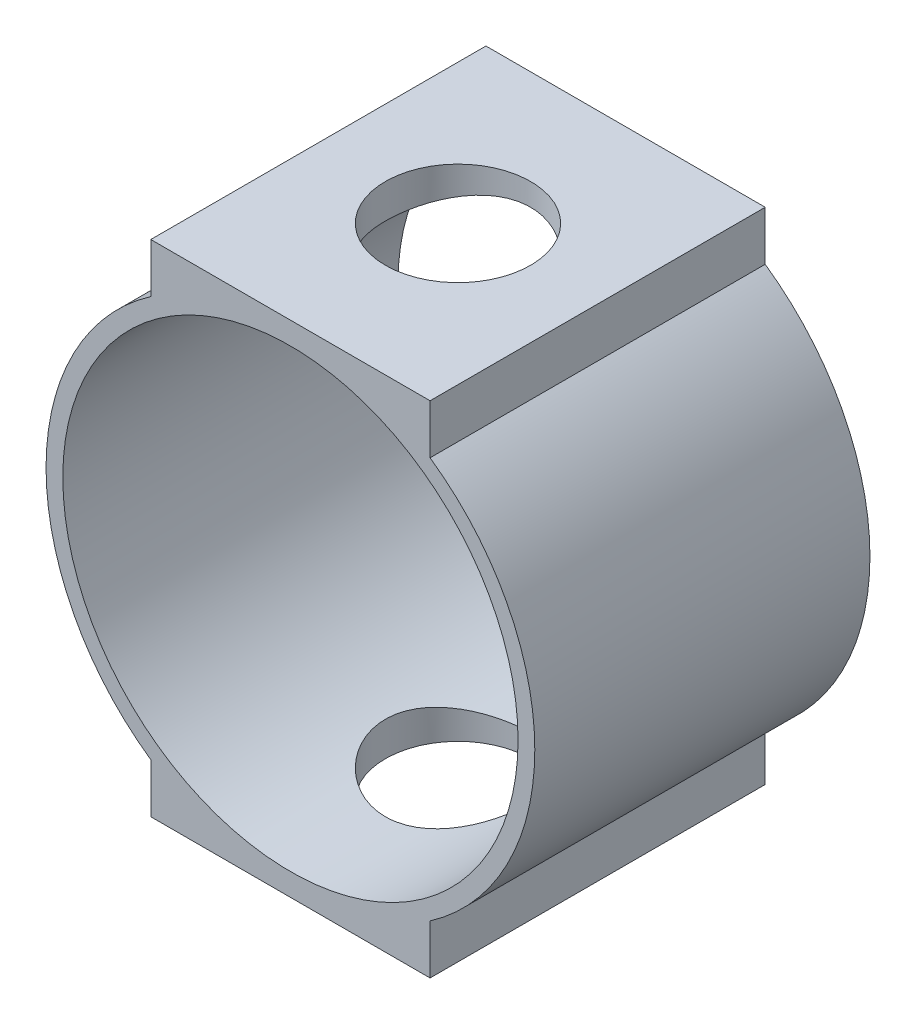
ISO-10303-21;
HEADER;
FILE_DESCRIPTION(('STEP AP214'),'2;1');
FILE_NAME('part.step','',(''),(''),'','','');
FILE_SCHEMA(('AUTOMOTIVE_DESIGN { 1 0 10303 214 1 1 1 1 }'));
ENDSEC;
DATA;
#1=APPLICATION_CONTEXT('core data for automotive mechanical design processes');
#2=APPLICATION_PROTOCOL_DEFINITION('international standard','automotive_design',2000,#1);
#3=PRODUCT_CONTEXT('',#1,'mechanical');
#4=PRODUCT('Part','Part','',(#3));
#5=PRODUCT_RELATED_PRODUCT_CATEGORY('part','',(#4));
#6=PRODUCT_DEFINITION_FORMATION('','',#4);
#7=PRODUCT_DEFINITION_CONTEXT('part definition',#1,'design');
#8=PRODUCT_DEFINITION('design','',#6,#7);
#9=PRODUCT_DEFINITION_SHAPE('','',#8);
#10=(LENGTH_UNIT() NAMED_UNIT(*) SI_UNIT(.MILLI.,.METRE.));
#11=(NAMED_UNIT(*) PLANE_ANGLE_UNIT() SI_UNIT($,.RADIAN.));
#12=(NAMED_UNIT(*) SI_UNIT($,.STERADIAN.) SOLID_ANGLE_UNIT());
#13=UNCERTAINTY_MEASURE_WITH_UNIT(LENGTH_MEASURE(1.E-05),#10,'distance_accuracy_value','');
#14=(GEOMETRIC_REPRESENTATION_CONTEXT(3) GLOBAL_UNCERTAINTY_ASSIGNED_CONTEXT((#13)) GLOBAL_UNIT_ASSIGNED_CONTEXT((#10,
#11,#12)) REPRESENTATION_CONTEXT('',''));
#15=CARTESIAN_POINT('',(0.,0.,0.));
#16=DIRECTION('',(0.,0.,1.));
#17=DIRECTION('',(1.,0.,0.));
#18=AXIS2_PLACEMENT_3D('',#15,#16,#17);
#19=CARTESIAN_POINT('',(-5.,-8.95,-6.));
#20=DIRECTION('',(0.,-1.,0.));
#21=DIRECTION('',(1.,0.,0.));
#22=AXIS2_PLACEMENT_3D('',#19,#20,#21);
#23=PLANE('',#22);
#24=CARTESIAN_POINT('',(0.,-8.95,0.));
#25=DIRECTION('',(0.,1.,0.));
#26=DIRECTION('',(0.,0.,1.));
#27=AXIS2_PLACEMENT_3D('',#24,#25,#26);
#28=CIRCLE('',#27,2.6);
#29=CARTESIAN_POINT('',(0.,-8.95,2.6));
#30=VERTEX_POINT('',#29);
#31=EDGE_CURVE('E182',#30,#30,#28,.T.);
#32=ORIENTED_EDGE('',*,*,#31,.T.);
#33=EDGE_LOOP('',(#32));
#34=FACE_BOUND('',#33,.T.);
#35=DIRECTION('',(0.,0.,1.));
#36=VECTOR('',#35,1.);
#37=CARTESIAN_POINT('',(5.,-8.95,-6.));
#38=LINE('',#37,#36);
#39=CARTESIAN_POINT('',(5.,-8.95,-6.));
#40=VERTEX_POINT('',#39);
#41=CARTESIAN_POINT('',(5.,-8.95,6.));
#42=VERTEX_POINT('',#41);
#43=EDGE_CURVE('E104',#40,#42,#38,.T.);
#44=ORIENTED_EDGE('',*,*,#43,.T.);
#45=DIRECTION('',(1.,0.,0.));
#46=VECTOR('',#45,1.);
#47=CARTESIAN_POINT('',(-5.,-8.95,6.));
#48=LINE('',#47,#46);
#49=CARTESIAN_POINT('',(-5.,-8.95,6.));
#50=VERTEX_POINT('',#49);
#51=EDGE_CURVE('E107',#50,#42,#48,.T.);
#52=ORIENTED_EDGE('',*,*,#51,.F.);
#53=DIRECTION('',(0.,0.,1.));
#54=VECTOR('',#53,1.);
#55=CARTESIAN_POINT('',(-5.,-8.95,-6.));
#56=LINE('',#55,#54);
#57=CARTESIAN_POINT('',(-5.,-8.95,-6.));
#58=VERTEX_POINT('',#57);
#59=EDGE_CURVE('E11',#58,#50,#56,.T.);
#60=ORIENTED_EDGE('',*,*,#59,.F.);
#61=DIRECTION('',(1.,0.,0.));
#62=VECTOR('',#61,1.);
#63=CARTESIAN_POINT('',(-5.,-8.95,-6.));
#64=LINE('',#63,#62);
#65=EDGE_CURVE('E108',#58,#40,#64,.T.);
#66=ORIENTED_EDGE('',*,*,#65,.T.);
#67=EDGE_LOOP('',(#44,#52,#60,#66));
#68=FACE_BOUND('',#67,.T.);
#69=ADVANCED_FACE('F37',(#34,#68),#23,.T.);
#70=CARTESIAN_POINT('',(-5.,-8.95,-6.));
#71=DIRECTION('',(-1.,0.,0.));
#72=DIRECTION('',(0.,-1.,0.));
#73=AXIS2_PLACEMENT_3D('',#70,#71,#72);
#74=PLANE('',#73);
#75=ORIENTED_EDGE('',*,*,#59,.T.);
#76=DIRECTION('',(0.,-1.,0.));
#77=VECTOR('',#76,1.);
#78=CARTESIAN_POINT('',(-5.,-8.95,6.));
#79=LINE('',#78,#77);
#80=CARTESIAN_POINT('',(-5.,-7.18070330817253,6.));
#81=VERTEX_POINT('',#80);
#82=EDGE_CURVE('E127',#81,#50,#79,.T.);
#83=ORIENTED_EDGE('',*,*,#82,.F.);
#84=DIRECTION('',(0.,0.,1.));
#85=VECTOR('',#84,1.);
#86=CARTESIAN_POINT('',(-5.,-7.18070330817253,-6.));
#87=LINE('',#86,#85);
#88=CARTESIAN_POINT('',(-5.,-7.18070330817253,-6.));
#89=VERTEX_POINT('',#88);
#90=EDGE_CURVE('E50',#89,#81,#87,.T.);
#91=ORIENTED_EDGE('',*,*,#90,.F.);
#92=DIRECTION('',(0.,-1.,0.));
#93=VECTOR('',#92,1.);
#94=CARTESIAN_POINT('',(-5.,-8.95,-6.));
#95=LINE('',#94,#93);
#96=EDGE_CURVE('E113',#89,#58,#95,.T.);
#97=ORIENTED_EDGE('',*,*,#96,.T.);
#98=EDGE_LOOP('',(#75,#83,#91,#97));
#99=FACE_BOUND('',#98,.T.);
#100=ADVANCED_FACE('F202',(#99),#74,.T.);
#101=CARTESIAN_POINT('',(0.,0.,-6.));
#102=DIRECTION('',(0.,0.,1.));
#103=DIRECTION('',(1.,0.,0.));
#104=AXIS2_PLACEMENT_3D('',#101,#102,#103);
#105=CYLINDRICAL_SURFACE('',#104,8.75);
#106=ORIENTED_EDGE('',*,*,#90,.T.);
#107=CARTESIAN_POINT('',(0.,0.,6.));
#108=DIRECTION('',(0.,0.,1.));
#109=DIRECTION('',(1.,0.,0.));
#110=AXIS2_PLACEMENT_3D('',#107,#108,#109);
#111=CIRCLE('',#110,8.75);
#112=CARTESIAN_POINT('',(-5.,7.18070330817254,6.));
#113=VERTEX_POINT('',#112);
#114=EDGE_CURVE('E144',#113,#81,#111,.T.);
#115=ORIENTED_EDGE('',*,*,#114,.F.);
#116=DIRECTION('',(0.,0.,1.));
#117=VECTOR('',#116,1.);
#118=CARTESIAN_POINT('',(-5.,7.18070330817254,-6.));
#119=LINE('',#118,#117);
#120=CARTESIAN_POINT('',(-5.,7.18070330817254,-6.));
#121=VERTEX_POINT('',#120);
#122=EDGE_CURVE('E169',#121,#113,#119,.T.);
#123=ORIENTED_EDGE('',*,*,#122,.F.);
#124=CARTESIAN_POINT('',(0.,0.,-6.));
#125=DIRECTION('',(0.,0.,1.));
#126=DIRECTION('',(1.,0.,0.));
#127=AXIS2_PLACEMENT_3D('',#124,#125,#126);
#128=CIRCLE('',#127,8.75);
#129=EDGE_CURVE('E165',#121,#89,#128,.T.);
#130=ORIENTED_EDGE('',*,*,#129,.T.);
#131=EDGE_LOOP('',(#106,#115,#123,#130));
#132=FACE_BOUND('',#131,.T.);
#133=ADVANCED_FACE('F207',(#132),#105,.T.);
#134=CARTESIAN_POINT('',(-5.,8.95,-6.));
#135=DIRECTION('',(-1.,0.,0.));
#136=DIRECTION('',(0.,-1.,0.));
#137=AXIS2_PLACEMENT_3D('',#134,#135,#136);
#138=PLANE('',#137);
#139=ORIENTED_EDGE('',*,*,#122,.T.);
#140=DIRECTION('',(0.,-1.,0.));
#141=VECTOR('',#140,1.);
#142=CARTESIAN_POINT('',(-5.,8.95,6.));
#143=LINE('',#142,#141);
#144=CARTESIAN_POINT('',(-5.,8.95,6.));
#145=VERTEX_POINT('',#144);
#146=EDGE_CURVE('E141',#145,#113,#143,.T.);
#147=ORIENTED_EDGE('',*,*,#146,.F.);
#148=DIRECTION('',(0.,0.,1.));
#149=VECTOR('',#148,1.);
#150=CARTESIAN_POINT('',(-5.,8.95,-6.));
#151=LINE('',#150,#149);
#152=CARTESIAN_POINT('',(-5.,8.95,-6.));
#153=VERTEX_POINT('',#152);
#154=EDGE_CURVE('E171',#153,#145,#151,.T.);
#155=ORIENTED_EDGE('',*,*,#154,.F.);
#156=DIRECTION('',(0.,-1.,0.));
#157=VECTOR('',#156,1.);
#158=CARTESIAN_POINT('',(-5.,8.95,-6.));
#159=LINE('',#158,#157);
#160=EDGE_CURVE('E162',#153,#121,#159,.T.);
#161=ORIENTED_EDGE('',*,*,#160,.T.);
#162=EDGE_LOOP('',(#139,#147,#155,#161));
#163=FACE_BOUND('',#162,.T.);
#164=ADVANCED_FACE('F221',(#163),#138,.T.);
#165=CARTESIAN_POINT('',(-5.,8.95,-6.));
#166=DIRECTION('',(0.,1.,0.));
#167=DIRECTION('',(-1.,0.,0.));
#168=AXIS2_PLACEMENT_3D('',#165,#166,#167);
#169=PLANE('',#168);
#170=CARTESIAN_POINT('',(0.,8.95,0.));
#171=DIRECTION('',(0.,1.,0.));
#172=DIRECTION('',(0.,0.,1.));
#173=AXIS2_PLACEMENT_3D('',#170,#171,#172);
#174=CIRCLE('',#173,2.6);
#175=CARTESIAN_POINT('',(0.,8.95,2.6));
#176=VERTEX_POINT('',#175);
#177=EDGE_CURVE('E211',#176,#176,#174,.T.);
#178=ORIENTED_EDGE('',*,*,#177,.F.);
#179=EDGE_LOOP('',(#178));
#180=FACE_BOUND('',#179,.T.);
#181=ORIENTED_EDGE('',*,*,#154,.T.);
#182=DIRECTION('',(-1.,0.,0.));
#183=VECTOR('',#182,1.);
#184=CARTESIAN_POINT('',(-5.,8.95,6.));
#185=LINE('',#184,#183);
#186=CARTESIAN_POINT('',(5.,8.95,6.));
#187=VERTEX_POINT('',#186);
#188=EDGE_CURVE('E138',#187,#145,#185,.T.);
#189=ORIENTED_EDGE('',*,*,#188,.F.);
#190=DIRECTION('',(0.,0.,1.));
#191=VECTOR('',#190,1.);
#192=CARTESIAN_POINT('',(5.,8.95,-6.));
#193=LINE('',#192,#191);
#194=CARTESIAN_POINT('',(5.,8.95,-6.));
#195=VERTEX_POINT('',#194);
#196=EDGE_CURVE('E173',#195,#187,#193,.T.);
#197=ORIENTED_EDGE('',*,*,#196,.F.);
#198=DIRECTION('',(-1.,0.,0.));
#199=VECTOR('',#198,1.);
#200=CARTESIAN_POINT('',(-5.,8.95,-6.));
#201=LINE('',#200,#199);
#202=EDGE_CURVE('E159',#195,#153,#201,.T.);
#203=ORIENTED_EDGE('',*,*,#202,.T.);
#204=EDGE_LOOP('',(#181,#189,#197,#203));
#205=FACE_BOUND('',#204,.T.);
#206=ADVANCED_FACE('F217',(#180,#205),#169,.T.);
#207=CARTESIAN_POINT('',(5.,8.95,-6.));
#208=DIRECTION('',(1.,0.,0.));
#209=DIRECTION('',(0.,1.,0.));
#210=AXIS2_PLACEMENT_3D('',#207,#208,#209);
#211=PLANE('',#210);
#212=ORIENTED_EDGE('',*,*,#196,.T.);
#213=DIRECTION('',(0.,1.,0.));
#214=VECTOR('',#213,1.);
#215=CARTESIAN_POINT('',(5.,8.95,6.));
#216=LINE('',#215,#214);
#217=CARTESIAN_POINT('',(5.,7.18070330817254,6.));
#218=VERTEX_POINT('',#217);
#219=EDGE_CURVE('E135',#218,#187,#216,.T.);
#220=ORIENTED_EDGE('',*,*,#219,.F.);
#221=DIRECTION('',(0.,0.,1.));
#222=VECTOR('',#221,1.);
#223=CARTESIAN_POINT('',(5.,7.18070330817254,-6.));
#224=LINE('',#223,#222);
#225=CARTESIAN_POINT('',(5.,7.18070330817254,-6.));
#226=VERTEX_POINT('',#225);
#227=EDGE_CURVE('E175',#226,#218,#224,.T.);
#228=ORIENTED_EDGE('',*,*,#227,.F.);
#229=DIRECTION('',(0.,1.,0.));
#230=VECTOR('',#229,1.);
#231=CARTESIAN_POINT('',(5.,8.95,-6.));
#232=LINE('',#231,#230);
#233=EDGE_CURVE('E156',#226,#195,#232,.T.);
#234=ORIENTED_EDGE('',*,*,#233,.T.);
#235=EDGE_LOOP('',(#212,#220,#228,#234));
#236=FACE_BOUND('',#235,.T.);
#237=ADVANCED_FACE('F220',(#236),#211,.T.);
#238=CARTESIAN_POINT('',(0.,0.,-6.));
#239=DIRECTION('',(0.,0.,1.));
#240=DIRECTION('',(1.,0.,0.));
#241=AXIS2_PLACEMENT_3D('',#238,#239,#240);
#242=CYLINDRICAL_SURFACE('',#241,8.75);
#243=ORIENTED_EDGE('',*,*,#227,.T.);
#244=CARTESIAN_POINT('',(0.,0.,6.));
#245=DIRECTION('',(0.,0.,1.));
#246=DIRECTION('',(1.,0.,0.));
#247=AXIS2_PLACEMENT_3D('',#244,#245,#246);
#248=CIRCLE('',#247,8.75);
#249=CARTESIAN_POINT('',(5.,-7.18070330817253,6.));
#250=VERTEX_POINT('',#249);
#251=EDGE_CURVE('E121',#250,#218,#248,.T.);
#252=ORIENTED_EDGE('',*,*,#251,.F.);
#253=DIRECTION('',(0.,0.,1.));
#254=VECTOR('',#253,1.);
#255=CARTESIAN_POINT('',(5.,-7.18070330817253,-6.));
#256=LINE('',#255,#254);
#257=CARTESIAN_POINT('',(5.,-7.18070330817253,-6.));
#258=VERTEX_POINT('',#257);
#259=EDGE_CURVE('E112',#258,#250,#256,.T.);
#260=ORIENTED_EDGE('',*,*,#259,.F.);
#261=CARTESIAN_POINT('',(0.,0.,-6.));
#262=DIRECTION('',(0.,0.,1.));
#263=DIRECTION('',(1.,0.,0.));
#264=AXIS2_PLACEMENT_3D('',#261,#262,#263);
#265=CIRCLE('',#264,8.75);
#266=EDGE_CURVE('E153',#258,#226,#265,.T.);
#267=ORIENTED_EDGE('',*,*,#266,.T.);
#268=EDGE_LOOP('',(#243,#252,#260,#267));
#269=FACE_BOUND('',#268,.T.);
#270=ADVANCED_FACE('F237',(#269),#242,.T.);
#271=CARTESIAN_POINT('',(5.,-8.95,-6.));
#272=DIRECTION('',(1.,0.,0.));
#273=DIRECTION('',(0.,0.,-1.));
#274=AXIS2_PLACEMENT_3D('',#271,#272,#273);
#275=PLANE('',#274);
#276=ORIENTED_EDGE('',*,*,#259,.T.);
#277=DIRECTION('',(0.,1.,0.));
#278=VECTOR('',#277,1.);
#279=CARTESIAN_POINT('',(5.,-8.95,6.));
#280=LINE('',#279,#278);
#281=EDGE_CURVE('E116',#42,#250,#280,.T.);
#282=ORIENTED_EDGE('',*,*,#281,.F.);
#283=ORIENTED_EDGE('',*,*,#43,.F.);
#284=DIRECTION('',(0.,1.,0.));
#285=VECTOR('',#284,1.);
#286=CARTESIAN_POINT('',(5.,-8.95,-6.));
#287=LINE('',#286,#285);
#288=EDGE_CURVE('E151',#40,#258,#287,.T.);
#289=ORIENTED_EDGE('',*,*,#288,.T.);
#290=EDGE_LOOP('',(#276,#282,#283,#289));
#291=FACE_BOUND('',#290,.T.);
#292=ADVANCED_FACE('F117',(#291),#275,.T.);
#293=CARTESIAN_POINT('',(0.,0.,-6.));
#294=DIRECTION('',(0.,0.,1.));
#295=DIRECTION('',(1.,0.,0.));
#296=AXIS2_PLACEMENT_3D('',#293,#294,#295);
#297=PLANE('',#296);
#298=CARTESIAN_POINT('',(0.,0.,-6.));
#299=DIRECTION('',(0.,0.,1.));
#300=DIRECTION('',(1.,0.,0.));
#301=AXIS2_PLACEMENT_3D('',#298,#299,#300);
#302=CIRCLE('',#301,8.15);
#303=CARTESIAN_POINT('',(8.15,0.,-6.));
#304=VERTEX_POINT('',#303);
#305=EDGE_CURVE('E147',#304,#304,#302,.T.);
#306=ORIENTED_EDGE('',*,*,#305,.T.);
#307=EDGE_LOOP('',(#306));
#308=FACE_BOUND('',#307,.T.);
#309=ORIENTED_EDGE('',*,*,#65,.F.);
#310=ORIENTED_EDGE('',*,*,#96,.F.);
#311=ORIENTED_EDGE('',*,*,#129,.F.);
#312=ORIENTED_EDGE('',*,*,#160,.F.);
#313=ORIENTED_EDGE('',*,*,#202,.F.);
#314=ORIENTED_EDGE('',*,*,#233,.F.);
#315=ORIENTED_EDGE('',*,*,#266,.F.);
#316=ORIENTED_EDGE('',*,*,#288,.F.);
#317=EDGE_LOOP('',(#309,#310,#311,#312,#313,#314,#315,#316));
#318=FACE_BOUND('',#317,.T.);
#319=ADVANCED_FACE('F199',(#308,#318),#297,.F.);
#320=CARTESIAN_POINT('',(0.,0.,-6.));
#321=DIRECTION('',(0.,0.,1.));
#322=DIRECTION('',(1.,0.,0.));
#323=AXIS2_PLACEMENT_3D('',#320,#321,#322);
#324=CYLINDRICAL_SURFACE('',#323,8.15);
#325=CARTESIAN_POINT('',(0.,-8.15,2.6));
#326=CARTESIAN_POINT('',(-0.142203505543342,-8.14999960176957,2.59999953192596));
#327=CARTESIAN_POINT('',(-0.284412564499907,-8.14624330447423,2.58829525410423));
#328=CARTESIAN_POINT('',(-0.564662629022311,-8.13162729718018,2.5419163710565));
#329=CARTESIAN_POINT('',(-0.70270284456147,-8.12076624950664,2.50723744017159));
#330=CARTESIAN_POINT('',(-0.970533832975618,-8.09312529483324,2.41620434909736));
#331=CARTESIAN_POINT('',(-1.10033731259692,-8.07635477987373,2.35988457038684));
#332=CARTESIAN_POINT('',(-1.34865766367496,-8.03862035554553,2.22731758449882));
#333=CARTESIAN_POINT('',(-1.4671726095874,-8.01765573264998,2.15106698589283));
#334=CARTESIAN_POINT('',(-1.69334964355843,-7.9730012459855,1.97823265063891));
#335=CARTESIAN_POINT('',(-1.80059948222446,-7.94925016538218,1.88112531626175));
#336=CARTESIAN_POINT('',(-1.99760068354416,-7.90204869336876,1.67044834944998));
#337=CARTESIAN_POINT('',(-2.08734861230465,-7.87859836180743,1.55687549406823));
#338=CARTESIAN_POINT('',(-2.24906958275262,-7.83399158743093,1.31287899701797));
#339=CARTESIAN_POINT('',(-2.32052124237097,-7.81291041359703,1.18209471046042));
#340=CARTESIAN_POINT('',(-2.44024305375827,-7.77635266503883,0.909584836043497));
#341=CARTESIAN_POINT('',(-2.48851960566809,-7.76087454324145,0.767862281509332));
#342=CARTESIAN_POINT('',(-2.55900063183534,-7.73791702111249,0.482162265851609));
#343=CARTESIAN_POINT('',(-2.58197226466877,-7.73020291295947,0.338393455238453));
#344=CARTESIAN_POINT('',(-2.60358860386407,-7.72295076103129,0.0488512809469417));
#345=CARTESIAN_POINT('',(-2.60224009279163,-7.72341043769543,-0.0969215125151101));
#346=CARTESIAN_POINT('',(-2.57585309536015,-7.73224719865844,-0.379928530138107));
#347=CARTESIAN_POINT('',(-2.5517976262642,-7.74029573413663,-0.517266411085056));
#348=CARTESIAN_POINT('',(-2.48227638831988,-7.76286842224203,-0.785844795620059));
#349=CARTESIAN_POINT('',(-2.43680825638451,-7.77739328958344,-0.91708462447448));
#350=CARTESIAN_POINT('',(-2.32507389191065,-7.81152837254946,-1.17204986341004));
#351=CARTESIAN_POINT('',(-2.25850436671023,-7.83121197147246,-1.29563211302177));
#352=CARTESIAN_POINT('',(-2.10666746684603,-7.8734139348707,-1.53019075287226));
#353=CARTESIAN_POINT('',(-2.02139506480944,-7.89593306084709,-1.64116374151619));
#354=CARTESIAN_POINT('',(-1.8297806831284,-7.9425790032405,-1.85290106159538));
#355=CARTESIAN_POINT('',(-1.72262955339293,-7.96673134571414,-1.95292891251348));
#356=CARTESIAN_POINT('',(-1.49277387168404,-8.01298019147837,-2.13377890847255));
#357=CARTESIAN_POINT('',(-1.37006806952173,-8.03507652927215,-2.21459950825013));
#358=CARTESIAN_POINT('',(-1.11112328692127,-8.07497282684995,-2.35526819501214));
#359=CARTESIAN_POINT('',(-0.974779075949874,-8.09273505248992,-2.41493400138804));
#360=CARTESIAN_POINT('',(-0.693289270583578,-8.12168902049882,-2.51026122336192));
#361=CARTESIAN_POINT('',(-0.548146482045122,-8.13288284548824,-2.54593024806411));
#362=CARTESIAN_POINT('',(-0.259425927101593,-8.14710060959532,-2.59098148942592));
#363=CARTESIAN_POINT('',(-0.11601866198274,-8.15043406578483,-2.60136014307767));
#364=CARTESIAN_POINT('',(0.170507439062349,-8.14947485960939,-2.59835436593639));
#365=CARTESIAN_POINT('',(0.313626315751039,-8.1451833636448,-2.58497356966224));
#366=CARTESIAN_POINT('',(0.591625296624572,-8.12966016383614,-2.53562531272935));
#367=CARTESIAN_POINT('',(0.726622939135559,-8.11861252631497,-2.50025649047762));
#368=CARTESIAN_POINT('',(0.988725350698189,-8.09087791141474,-2.40867213463251));
#369=CARTESIAN_POINT('',(1.11582913113026,-8.07419022936117,-2.35245399601297));
#370=CARTESIAN_POINT('',(1.36207294235109,-8.03636567180337,-2.21919925029278));
#371=CARTESIAN_POINT('',(1.48093438604583,-8.01512798276128,-2.14167725055028));
#372=CARTESIAN_POINT('',(1.70429264545503,-7.97062594914018,-1.9685938796744));
#373=CARTESIAN_POINT('',(1.80878539657931,-7.94736103413116,-1.87302742222534));
#374=CARTESIAN_POINT('',(2.00493471687227,-7.900211549245,-1.6618802984464));
#375=CARTESIAN_POINT('',(2.09588067809248,-7.87634120648332,-1.54563478823418));
#376=CARTESIAN_POINT('',(2.25704582565401,-7.83168320318836,-1.2990147249848));
#377=CARTESIAN_POINT('',(2.32726520484013,-7.81089551397427,-1.16864030342166));
#378=CARTESIAN_POINT('',(2.44457689898703,-7.77498023357565,-0.897642167126483));
#379=CARTESIAN_POINT('',(2.49174714788359,-7.75983361067107,-0.757054863002286));
#380=CARTESIAN_POINT('',(2.56156261296978,-7.73707125576271,-0.469346570496737));
#381=CARTESIAN_POINT('',(2.5842176750627,-7.72945250048865,-0.322228229872998));
#382=CARTESIAN_POINT('',(2.60363336408836,-7.72293250945406,-0.0330881435754913));
#383=CARTESIAN_POINT('',(2.60156383774209,-7.72363741943296,0.108847106944111));
#384=CARTESIAN_POINT('',(2.57443005545274,-7.73272331710791,0.390239276185882));
#385=CARTESIAN_POINT('',(2.5493669586196,-7.741103917871,0.529696319473684));
#386=CARTESIAN_POINT('',(2.4777548485648,-7.7643160185789,0.799984478447507));
#387=CARTESIAN_POINT('',(2.43155405508461,-7.77904275291031,0.930917538655435));
#388=CARTESIAN_POINT('',(2.31925439492733,-7.81325724028084,1.18327712490155));
#389=CARTESIAN_POINT('',(2.25315136103076,-7.83274599025077,1.30470165328511));
#390=CARTESIAN_POINT('',(2.09979213809291,-7.87527398149951,1.53992731782664));
#391=CARTESIAN_POINT('',(2.01178713947454,-7.89842511767899,1.653219951573));
#392=CARTESIAN_POINT('',(1.81842376486647,-7.94516931099663,1.86380783228797));
#393=CARTESIAN_POINT('',(1.71306066845869,-7.96876248679343,1.96109871326565));
#394=CARTESIAN_POINT('',(1.48359515038869,-8.01471041004328,2.14029318602048));
#395=CARTESIAN_POINT('',(1.35897111150286,-8.03699422015018,2.22154911530181));
#396=CARTESIAN_POINT('',(1.09712394161239,-8.07690031608166,2.36185541650831));
#397=CARTESIAN_POINT('',(0.959905265979692,-8.09452424185102,2.42091360353801));
#398=CARTESIAN_POINT('',(0.687011664483948,-8.12206510068652,2.51140637956852));
#399=CARTESIAN_POINT('',(0.551943046794303,-8.13244730416438,2.54453010711903));
#400=CARTESIAN_POINT('',(0.277917470276983,-8.14641418951909,2.58882469520039));
#401=CARTESIAN_POINT('',(0.138961386675345,-8.15000038915112,2.60000045740235));
#402=CARTESIAN_POINT('',(0.,-8.15,2.6));
#403=B_SPLINE_CURVE_WITH_KNOTS('',3,(#325,#326,#327,#328,#329,#330,#331,#332,#333,#334,#335,
#336,#337,#338,#339,#340,#341,#342,#343,#344,#345,#346,#347,#348,#349,#350,#351,#352,#353,#354,
#355,#356,#357,#358,#359,#360,#361,#362,#363,#364,#365,#366,#367,#368,#369,#370,#371,#372,#373,
#374,#375,#376,#377,#378,#379,#380,#381,#382,#383,#384,#385,#386,#387,#388,#389,#390,#391,#392,
#393,#394,#395,#396,#397,#398,#399,#400,#401,#402),.UNSPECIFIED.,.T.,.F.,(4,2,2,2,2,2,2,2,2,2,2,
2,2,2,2,2,2,2,2,2,2,2,2,2,2,2,2,2,2,2,2,2,2,2,2,2,2,2,4),(0.,0.426099557552509,
0.852279363775813,1.27778486601593,1.70336281946395,2.14123076555025,2.57918453554548,
3.02849710012959,3.47768550907077,3.91284552369596,4.34788417983968,4.76491331414525,
5.18198848229292,5.60535308062191,6.02883162002454,6.47244959606541,6.91610325002461,
7.36349171608204,7.81073825344177,8.24005608216324,8.66930824314677,9.08735671378468,
9.50545743526279,9.93401223659283,10.3626880184458,10.8091128452844,11.2555335183547,
11.7004341210044,12.1451559742115,12.5689224991852,12.9926676631875,13.4096703829569,
13.8267604774016,14.2607567752947,14.694871290976,15.1439824071549,15.5929352574494,
16.0094131310228,16.4257979814033),.UNSPECIFIED.);
#404=CARTESIAN_POINT('',(0.,-8.15,2.6));
#405=VERTEX_POINT('',#404);
#406=EDGE_CURVE('E40',#405,#405,#403,.T.);
#407=ORIENTED_EDGE('',*,*,#406,.T.);
#408=EDGE_LOOP('',(#407));
#409=FACE_BOUND('',#408,.T.);
#410=CARTESIAN_POINT('',(0.,8.15,2.6));
#411=CARTESIAN_POINT('',(0.142203505543339,8.14999960176957,2.59999953192596));
#412=CARTESIAN_POINT('',(0.284412564499904,8.14624330447423,2.58829525410423));
#413=CARTESIAN_POINT('',(0.564662629022308,8.13162729718018,2.5419163710565));
#414=CARTESIAN_POINT('',(0.702702844561467,8.12076624950664,2.50723744017159));
#415=CARTESIAN_POINT('',(0.970533832975615,8.09312529483324,2.41620434909736));
#416=CARTESIAN_POINT('',(1.10033731259692,8.07635477987373,2.35988457038684));
#417=CARTESIAN_POINT('',(1.34865766367496,8.03862035554553,2.22731758449882));
#418=CARTESIAN_POINT('',(1.4671726095874,8.01765573264998,2.15106698589283));
#419=CARTESIAN_POINT('',(1.69334964355843,7.9730012459855,1.9782326506389));
#420=CARTESIAN_POINT('',(1.80059948222446,7.94925016538218,1.88112531626175));
#421=CARTESIAN_POINT('',(1.99760068354416,7.90204869336876,1.67044834944998));
#422=CARTESIAN_POINT('',(2.08734861230465,7.87859836180743,1.55687549406823));
#423=CARTESIAN_POINT('',(2.24906958275262,7.83399158743093,1.31287899701797));
#424=CARTESIAN_POINT('',(2.32052124237097,7.81291041359703,1.18209471046042));
#425=CARTESIAN_POINT('',(2.44024305375826,7.77635266503883,0.909584836043496));
#426=CARTESIAN_POINT('',(2.48851960566808,7.76087454324145,0.767862281509331));
#427=CARTESIAN_POINT('',(2.55900063183534,7.73791702111249,0.482162265851608));
#428=CARTESIAN_POINT('',(2.58197226466877,7.73020291295947,0.338393455238452));
#429=CARTESIAN_POINT('',(2.60358860386407,7.72295076103129,0.048851280946941));
#430=CARTESIAN_POINT('',(2.60224009279163,7.72341043769543,-0.0969215125151108));
#431=CARTESIAN_POINT('',(2.57585309536015,7.73224719865844,-0.379928530138107));
#432=CARTESIAN_POINT('',(2.5517976262642,7.74029573413663,-0.517266411085056));
#433=CARTESIAN_POINT('',(2.48227638831987,7.76286842224203,-0.785844795620059));
#434=CARTESIAN_POINT('',(2.43680825638451,7.77739328958344,-0.917084624474481));
#435=CARTESIAN_POINT('',(2.32507389191065,7.81152837254946,-1.17204986341004));
#436=CARTESIAN_POINT('',(2.25850436671022,7.83121197147246,-1.29563211302177));
#437=CARTESIAN_POINT('',(2.10666746684603,7.8734139348707,-1.53019075287226));
#438=CARTESIAN_POINT('',(2.02139506480944,7.89593306084709,-1.64116374151619));
#439=CARTESIAN_POINT('',(1.8297806831284,7.9425790032405,-1.85290106159538));
#440=CARTESIAN_POINT('',(1.72262955339293,7.96673134571414,-1.95292891251348));
#441=CARTESIAN_POINT('',(1.49277387168404,8.01298019147837,-2.13377890847255));
#442=CARTESIAN_POINT('',(1.37006806952173,8.03507652927215,-2.21459950825013));
#443=CARTESIAN_POINT('',(1.11112328692126,8.07497282684995,-2.35526819501214));
#444=CARTESIAN_POINT('',(0.974779075949872,8.09273505248992,-2.41493400138804));
#445=CARTESIAN_POINT('',(0.693289270583576,8.12168902049882,-2.51026122336192));
#446=CARTESIAN_POINT('',(0.54814648204512,8.13288284548824,-2.54593024806411));
#447=CARTESIAN_POINT('',(0.259425927101591,8.14710060959532,-2.59098148942592));
#448=CARTESIAN_POINT('',(0.116018661982738,8.15043406578483,-2.60136014307767));
#449=CARTESIAN_POINT('',(-0.170507439062351,8.14947485960939,-2.59835436593639));
#450=CARTESIAN_POINT('',(-0.313626315751042,8.14518336364479,-2.58497356966224));
#451=CARTESIAN_POINT('',(-0.591625296624574,8.12966016383614,-2.53562531272935));
#452=CARTESIAN_POINT('',(-0.726622939135561,8.11861252631497,-2.50025649047762));
#453=CARTESIAN_POINT('',(-0.988725350698192,8.09087791141474,-2.40867213463251));
#454=CARTESIAN_POINT('',(-1.11582913113026,8.07419022936117,-2.35245399601297));
#455=CARTESIAN_POINT('',(-1.36207294235109,8.03636567180337,-2.21919925029278));
#456=CARTESIAN_POINT('',(-1.48093438604583,8.01512798276127,-2.14167725055028));
#457=CARTESIAN_POINT('',(-1.70429264545503,7.97062594914018,-1.9685938796744));
#458=CARTESIAN_POINT('',(-1.80878539657931,7.94736103413116,-1.87302742222534));
#459=CARTESIAN_POINT('',(-2.00493471687227,7.900211549245,-1.6618802984464));
#460=CARTESIAN_POINT('',(-2.09588067809248,7.87634120648332,-1.54563478823417));
#461=CARTESIAN_POINT('',(-2.25704582565401,7.83168320318836,-1.2990147249848));
#462=CARTESIAN_POINT('',(-2.32726520484014,7.81089551397427,-1.16864030342166));
#463=CARTESIAN_POINT('',(-2.44457689898704,7.77498023357565,-0.897642167126482));
#464=CARTESIAN_POINT('',(-2.4917471478836,7.75983361067107,-0.757054863002285));
#465=CARTESIAN_POINT('',(-2.56156261296978,7.73707125576271,-0.469346570496735));
#466=CARTESIAN_POINT('',(-2.5842176750627,7.72945250048864,-0.322228229872997));
#467=CARTESIAN_POINT('',(-2.60363336408836,7.72293250945406,-0.0330881435754903));
#468=CARTESIAN_POINT('',(-2.60156383774209,7.72363741943296,0.108847106944112));
#469=CARTESIAN_POINT('',(-2.57443005545274,7.73272331710791,0.390239276185882));
#470=CARTESIAN_POINT('',(-2.5493669586196,7.741103917871,0.529696319473684));
#471=CARTESIAN_POINT('',(-2.47775484856481,7.7643160185789,0.799984478447507));
#472=CARTESIAN_POINT('',(-2.43155405508461,7.77904275291031,0.930917538655434));
#473=CARTESIAN_POINT('',(-2.31925439492733,7.81325724028084,1.18327712490155));
#474=CARTESIAN_POINT('',(-2.25315136103076,7.83274599025077,1.30470165328511));
#475=CARTESIAN_POINT('',(-2.09979213809292,7.87527398149951,1.53992731782664));
#476=CARTESIAN_POINT('',(-2.01178713947454,7.89842511767899,1.653219951573));
#477=CARTESIAN_POINT('',(-1.81842376486647,7.94516931099663,1.86380783228797));
#478=CARTESIAN_POINT('',(-1.71306066845869,7.96876248679343,1.96109871326565));
#479=CARTESIAN_POINT('',(-1.4835951503887,8.01471041004328,2.14029318602048));
#480=CARTESIAN_POINT('',(-1.35897111150286,8.03699422015019,2.22154911530181));
#481=CARTESIAN_POINT('',(-1.09712394161239,8.07690031608166,2.36185541650831));
#482=CARTESIAN_POINT('',(-0.959905265979696,8.09452424185102,2.42091360353801));
#483=CARTESIAN_POINT('',(-0.687011664483952,8.12206510068652,2.51140637956853));
#484=CARTESIAN_POINT('',(-0.551943046794307,8.13244730416438,2.54453010711903));
#485=CARTESIAN_POINT('',(-0.277917470276987,8.14641418951909,2.58882469520039));
#486=CARTESIAN_POINT('',(-0.138961386675348,8.15000038915112,2.60000045740235));
#487=CARTESIAN_POINT('',(0.,8.15,2.6));
#488=B_SPLINE_CURVE_WITH_KNOTS('',3,(#410,#411,#412,#413,#414,#415,#416,#417,#418,#419,#420,
#421,#422,#423,#424,#425,#426,#427,#428,#429,#430,#431,#432,#433,#434,#435,#436,#437,#438,#439,
#440,#441,#442,#443,#444,#445,#446,#447,#448,#449,#450,#451,#452,#453,#454,#455,#456,#457,#458,
#459,#460,#461,#462,#463,#464,#465,#466,#467,#468,#469,#470,#471,#472,#473,#474,#475,#476,#477,
#478,#479,#480,#481,#482,#483,#484,#485,#486,#487),.UNSPECIFIED.,.T.,.F.,(4,2,2,2,2,2,2,2,2,2,2,
2,2,2,2,2,2,2,2,2,2,2,2,2,2,2,2,2,2,2,2,2,2,2,2,2,2,2,4),(0.,0.426099557552509,
0.852279363775813,1.27778486601593,1.70336281946396,2.14123076555025,2.57918453554548,
3.02849710012959,3.47768550907077,3.91284552369596,4.34788417983968,4.76491331414525,
5.18198848229292,5.6053530806219,6.02883162002453,6.47244959606541,6.9161032500246,
7.36349171608203,7.81073825344177,8.24005608216324,8.66930824314676,9.08735671378468,
9.50545743526279,9.93401223659283,10.3626880184458,10.8091128452844,11.2555335183547,
11.7004341210044,12.1451559742115,12.5689224991852,12.9926676631875,13.4096703829569,
13.8267604774016,14.2607567752947,14.694871290976,15.1439824071548,15.5929352574493,
16.0094131310228,16.4257979814033),.UNSPECIFIED.);
#489=CARTESIAN_POINT('',(0.,8.15,2.6));
#490=VERTEX_POINT('',#489);
#491=EDGE_CURVE('E177',#490,#490,#488,.T.);
#492=ORIENTED_EDGE('',*,*,#491,.T.);
#493=EDGE_LOOP('',(#492));
#494=FACE_BOUND('',#493,.T.);
#495=ORIENTED_EDGE('',*,*,#305,.F.);
#496=EDGE_LOOP('',(#495));
#497=FACE_BOUND('',#496,.T.);
#498=CARTESIAN_POINT('',(0.,0.,6.));
#499=DIRECTION('',(0.,0.,1.));
#500=DIRECTION('',(1.,0.,0.));
#501=AXIS2_PLACEMENT_3D('',#498,#499,#500);
#502=CIRCLE('',#501,8.15);
#503=CARTESIAN_POINT('',(8.15,0.,6.));
#504=VERTEX_POINT('',#503);
#505=EDGE_CURVE('E128',#504,#504,#502,.T.);
#506=ORIENTED_EDGE('',*,*,#505,.T.);
#507=EDGE_LOOP('',(#506));
#508=FACE_BOUND('',#507,.T.);
#509=ADVANCED_FACE('F183',(#409,#494,#497,#508),#324,.F.);
#510=CARTESIAN_POINT('',(0.,0.,6.));
#511=DIRECTION('',(0.,0.,1.));
#512=DIRECTION('',(1.,0.,0.));
#513=AXIS2_PLACEMENT_3D('',#510,#511,#512);
#514=PLANE('',#513);
#515=ORIENTED_EDGE('',*,*,#51,.T.);
#516=ORIENTED_EDGE('',*,*,#281,.T.);
#517=ORIENTED_EDGE('',*,*,#251,.T.);
#518=ORIENTED_EDGE('',*,*,#219,.T.);
#519=ORIENTED_EDGE('',*,*,#188,.T.);
#520=ORIENTED_EDGE('',*,*,#146,.T.);
#521=ORIENTED_EDGE('',*,*,#114,.T.);
#522=ORIENTED_EDGE('',*,*,#82,.T.);
#523=EDGE_LOOP('',(#515,#516,#517,#518,#519,#520,#521,#522));
#524=FACE_BOUND('',#523,.T.);
#525=ORIENTED_EDGE('',*,*,#505,.F.);
#526=EDGE_LOOP('',(#525));
#527=FACE_BOUND('',#526,.T.);
#528=ADVANCED_FACE('F124',(#524,#527),#514,.T.);
#529=CARTESIAN_POINT('',(0.,-8.95,0.));
#530=DIRECTION('',(0.,1.,0.));
#531=DIRECTION('',(0.,0.,1.));
#532=AXIS2_PLACEMENT_3D('',#529,#530,#531);
#533=CYLINDRICAL_SURFACE('',#532,2.6);
#534=ORIENTED_EDGE('',*,*,#177,.T.);
#535=EDGE_LOOP('',(#534));
#536=FACE_BOUND('',#535,.T.);
#537=ORIENTED_EDGE('',*,*,#491,.F.);
#538=EDGE_LOOP('',(#537));
#539=FACE_BOUND('',#538,.T.);
#540=ADVANCED_FACE('F190',(#536,#539),#533,.F.);
#541=ORIENTED_EDGE('',*,*,#31,.F.);
#542=EDGE_LOOP('',(#541));
#543=FACE_BOUND('',#542,.T.);
#544=ORIENTED_EDGE('',*,*,#406,.F.);
#545=EDGE_LOOP('',(#544));
#546=FACE_BOUND('',#545,.T.);
#547=ADVANCED_FACE('F187',(#543,#546),#533,.F.);
#548=CLOSED_SHELL('',(#69,#100,#133,#164,#206,#237,#270,#292,#319,#509,#528,#540,#547));
#549=MANIFOLD_SOLID_BREP('B2',#548);
#550=ADVANCED_BREP_SHAPE_REPRESENTATION('',(#18,#549),#14);
#551=SHAPE_DEFINITION_REPRESENTATION(#9,#550);
ENDSEC;
END-ISO-10303-21;
